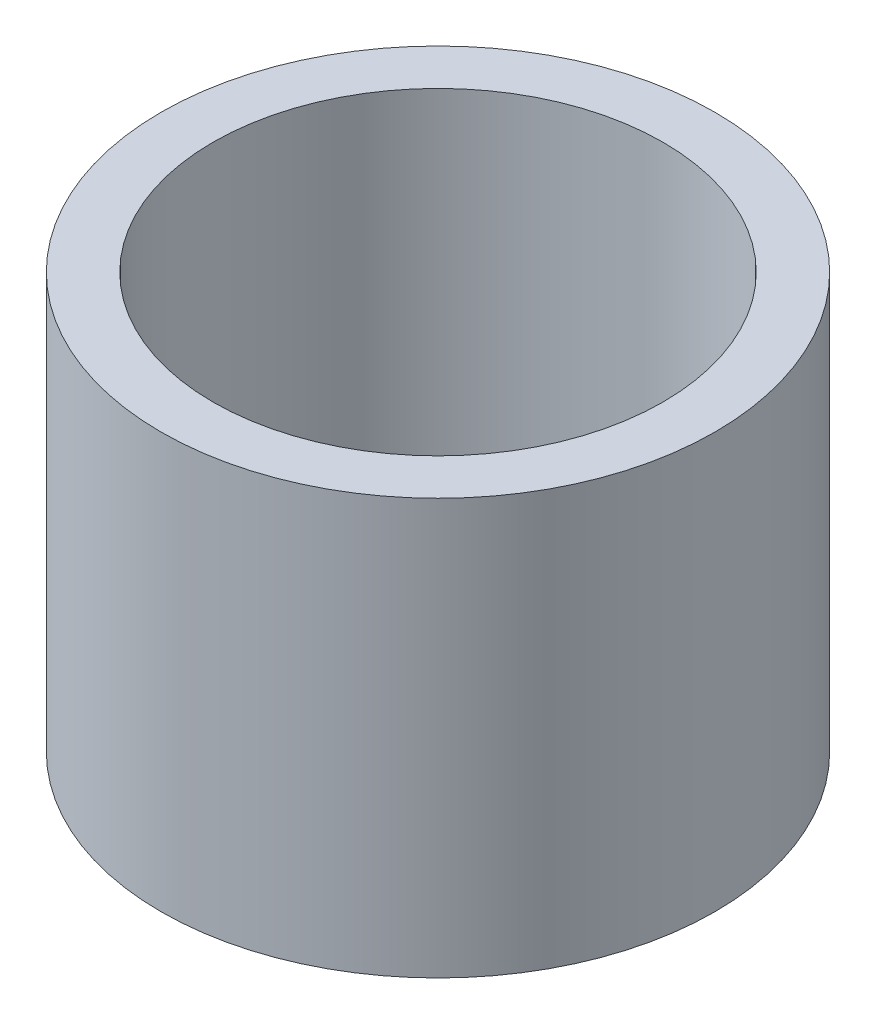
ISO-10303-21;
HEADER;
FILE_DESCRIPTION(('STEP AP214'),'2;1');
FILE_NAME('part.step','',(''),(''),'','','');
FILE_SCHEMA(('AUTOMOTIVE_DESIGN { 1 0 10303 214 1 1 1 1 }'));
ENDSEC;
DATA;
#1=APPLICATION_CONTEXT('core data for automotive mechanical design processes');
#2=APPLICATION_PROTOCOL_DEFINITION('international standard','automotive_design',2000,#1);
#3=PRODUCT_CONTEXT('',#1,'mechanical');
#4=PRODUCT('Part','Part','',(#3));
#5=PRODUCT_RELATED_PRODUCT_CATEGORY('part','',(#4));
#6=PRODUCT_DEFINITION_FORMATION('','',#4);
#7=PRODUCT_DEFINITION_CONTEXT('part definition',#1,'design');
#8=PRODUCT_DEFINITION('design','',#6,#7);
#9=PRODUCT_DEFINITION_SHAPE('','',#8);
#10=(LENGTH_UNIT() NAMED_UNIT(*) SI_UNIT(.MILLI.,.METRE.));
#11=(NAMED_UNIT(*) PLANE_ANGLE_UNIT() SI_UNIT($,.RADIAN.));
#12=(NAMED_UNIT(*) SI_UNIT($,.STERADIAN.) SOLID_ANGLE_UNIT());
#13=UNCERTAINTY_MEASURE_WITH_UNIT(LENGTH_MEASURE(1.E-05),#10,'distance_accuracy_value','');
#14=(GEOMETRIC_REPRESENTATION_CONTEXT(3) GLOBAL_UNCERTAINTY_ASSIGNED_CONTEXT((#13)) GLOBAL_UNIT_ASSIGNED_CONTEXT((#10,
#11,#12)) REPRESENTATION_CONTEXT('',''));
#15=CARTESIAN_POINT('',(0.,0.,0.));
#16=DIRECTION('',(0.,0.,1.));
#17=DIRECTION('',(1.,0.,0.));
#18=AXIS2_PLACEMENT_3D('',#15,#16,#17);
#19=CARTESIAN_POINT('',(0.,60.,0.));
#20=DIRECTION('',(0.,1.,0.));
#21=DIRECTION('',(0.,0.,1.));
#22=AXIS2_PLACEMENT_3D('',#19,#20,#21);
#23=PLANE('',#22);
#24=CARTESIAN_POINT('',(0.,60.,0.));
#25=DIRECTION('',(0.,1.,0.));
#26=DIRECTION('',(0.,0.,1.));
#27=AXIS2_PLACEMENT_3D('',#24,#25,#26);
#28=CIRCLE('',#27,40.);
#29=CARTESIAN_POINT('',(0.,60.,-40.));
#30=VERTEX_POINT('',#29);
#31=EDGE_CURVE('E10',#30,#30,#28,.T.);
#32=ORIENTED_EDGE('',*,*,#31,.T.);
#33=EDGE_LOOP('',(#32));
#34=FACE_BOUND('',#33,.T.);
#35=CARTESIAN_POINT('',(0.,60.,0.));
#36=DIRECTION('',(0.,1.,0.));
#37=DIRECTION('',(0.,0.,1.));
#38=AXIS2_PLACEMENT_3D('',#35,#36,#37);
#39=CIRCLE('',#38,32.5);
#40=CARTESIAN_POINT('',(0.,60.,-32.5));
#41=VERTEX_POINT('',#40);
#42=EDGE_CURVE('E50',#41,#41,#39,.T.);
#43=ORIENTED_EDGE('',*,*,#42,.F.);
#44=EDGE_LOOP('',(#43));
#45=FACE_BOUND('',#44,.T.);
#46=ADVANCED_FACE('F37',(#34,#45),#23,.T.);
#47=CARTESIAN_POINT('',(0.,0.,0.));
#48=DIRECTION('',(0.,1.,0.));
#49=DIRECTION('',(0.,0.,1.));
#50=AXIS2_PLACEMENT_3D('',#47,#48,#49);
#51=PLANE('',#50);
#52=CARTESIAN_POINT('',(0.,0.,0.));
#53=DIRECTION('',(0.,1.,0.));
#54=DIRECTION('',(0.,0.,1.));
#55=AXIS2_PLACEMENT_3D('',#52,#53,#54);
#56=CIRCLE('',#55,40.);
#57=CARTESIAN_POINT('',(0.,0.,-40.));
#58=VERTEX_POINT('',#57);
#59=EDGE_CURVE('E41',#58,#58,#56,.T.);
#60=ORIENTED_EDGE('',*,*,#59,.F.);
#61=EDGE_LOOP('',(#60));
#62=FACE_BOUND('',#61,.T.);
#63=CARTESIAN_POINT('',(0.,0.,0.));
#64=DIRECTION('',(0.,1.,0.));
#65=DIRECTION('',(0.,0.,1.));
#66=AXIS2_PLACEMENT_3D('',#63,#64,#65);
#67=CIRCLE('',#66,32.5);
#68=CARTESIAN_POINT('',(0.,0.,-32.5));
#69=VERTEX_POINT('',#68);
#70=EDGE_CURVE('E52',#69,#69,#67,.T.);
#71=ORIENTED_EDGE('',*,*,#70,.T.);
#72=EDGE_LOOP('',(#71));
#73=FACE_BOUND('',#72,.T.);
#74=ADVANCED_FACE('F64',(#62,#73),#51,.F.);
#75=CARTESIAN_POINT('',(0.,60.,0.));
#76=DIRECTION('',(0.,-1.,0.));
#77=DIRECTION('',(0.,0.,-1.));
#78=AXIS2_PLACEMENT_3D('',#75,#76,#77);
#79=CYLINDRICAL_SURFACE('',#78,40.);
#80=CARTESIAN_POINT('',(0.,60.,-40.));
#81=CARTESIAN_POINT('',(0.,59.375,-40.));
#82=CARTESIAN_POINT('',(0.,58.75,-40.));
#83=CARTESIAN_POINT('',(0.,57.5,-40.));
#84=CARTESIAN_POINT('',(0.,56.875,-40.));
#85=CARTESIAN_POINT('',(0.,55.625,-40.));
#86=CARTESIAN_POINT('',(0.,55.,-40.));
#87=CARTESIAN_POINT('',(0.,53.75,-40.));
#88=CARTESIAN_POINT('',(0.,53.125,-40.));
#89=CARTESIAN_POINT('',(0.,51.875,-40.));
#90=CARTESIAN_POINT('',(0.,51.25,-40.));
#91=CARTESIAN_POINT('',(0.,50.,-40.));
#92=CARTESIAN_POINT('',(0.,49.375,-40.));
#93=CARTESIAN_POINT('',(0.,48.125,-40.));
#94=CARTESIAN_POINT('',(0.,47.5,-40.));
#95=CARTESIAN_POINT('',(0.,46.25,-40.));
#96=CARTESIAN_POINT('',(0.,45.625,-40.));
#97=CARTESIAN_POINT('',(0.,44.375,-40.));
#98=CARTESIAN_POINT('',(0.,43.75,-40.));
#99=CARTESIAN_POINT('',(0.,42.5,-40.));
#100=CARTESIAN_POINT('',(0.,41.875,-40.));
#101=CARTESIAN_POINT('',(0.,40.625,-40.));
#102=CARTESIAN_POINT('',(0.,40.,-40.));
#103=CARTESIAN_POINT('',(0.,38.75,-40.));
#104=CARTESIAN_POINT('',(0.,38.125,-40.));
#105=CARTESIAN_POINT('',(0.,36.875,-40.));
#106=CARTESIAN_POINT('',(0.,36.25,-40.));
#107=CARTESIAN_POINT('',(0.,35.,-40.));
#108=CARTESIAN_POINT('',(0.,34.375,-40.));
#109=CARTESIAN_POINT('',(0.,33.125,-40.));
#110=CARTESIAN_POINT('',(0.,32.5,-40.));
#111=CARTESIAN_POINT('',(0.,31.25,-40.));
#112=CARTESIAN_POINT('',(0.,30.625,-40.));
#113=CARTESIAN_POINT('',(0.,29.375,-40.));
#114=CARTESIAN_POINT('',(0.,28.75,-40.));
#115=CARTESIAN_POINT('',(0.,27.5,-40.));
#116=CARTESIAN_POINT('',(0.,26.875,-40.));
#117=CARTESIAN_POINT('',(0.,25.625,-40.));
#118=CARTESIAN_POINT('',(0.,25.,-40.));
#119=CARTESIAN_POINT('',(0.,23.75,-40.));
#120=CARTESIAN_POINT('',(0.,23.125,-40.));
#121=CARTESIAN_POINT('',(0.,21.875,-40.));
#122=CARTESIAN_POINT('',(0.,21.25,-40.));
#123=CARTESIAN_POINT('',(0.,20.,-40.));
#124=CARTESIAN_POINT('',(0.,19.375,-40.));
#125=CARTESIAN_POINT('',(0.,18.125,-40.));
#126=CARTESIAN_POINT('',(0.,17.5,-40.));
#127=CARTESIAN_POINT('',(0.,16.25,-40.));
#128=CARTESIAN_POINT('',(0.,15.625,-40.));
#129=CARTESIAN_POINT('',(0.,14.375,-40.));
#130=CARTESIAN_POINT('',(0.,13.75,-40.));
#131=CARTESIAN_POINT('',(0.,12.5,-40.));
#132=CARTESIAN_POINT('',(0.,11.875,-40.));
#133=CARTESIAN_POINT('',(0.,10.625,-40.));
#134=CARTESIAN_POINT('',(0.,10.,-40.));
#135=CARTESIAN_POINT('',(0.,8.75,-40.));
#136=CARTESIAN_POINT('',(0.,8.125,-40.));
#137=CARTESIAN_POINT('',(0.,6.875,-40.));
#138=CARTESIAN_POINT('',(0.,6.25,-40.));
#139=CARTESIAN_POINT('',(0.,5.,-40.));
#140=CARTESIAN_POINT('',(0.,4.375,-40.));
#141=CARTESIAN_POINT('',(0.,3.125,-40.));
#142=CARTESIAN_POINT('',(0.,2.5,-40.));
#143=CARTESIAN_POINT('',(0.,1.25,-40.));
#144=CARTESIAN_POINT('',(0.,0.625000000000001,-40.));
#145=CARTESIAN_POINT('',(0.,0.,-40.));
#146=B_SPLINE_CURVE_WITH_KNOTS('',3,(#80,#81,#82,#83,#84,#85,#86,#87,#88,#89,#90,#91,#92,#93,
#94,#95,#96,#97,#98,#99,#100,#101,#102,#103,#104,#105,#106,#107,#108,#109,#110,#111,#112,#113,
#114,#115,#116,#117,#118,#119,#120,#121,#122,#123,#124,#125,#126,#127,#128,#129,#130,#131,#132,
#133,#134,#135,#136,#137,#138,#139,#140,#141,#142,#143,#144,#145),.UNSPECIFIED.,.F.,.F.,(4,2,2,
2,2,2,2,2,2,2,2,2,2,2,2,2,2,2,2,2,2,2,2,2,2,2,2,2,2,2,2,2,4),(0.,1.875,3.75,5.62500000000001,
7.50000000000001,9.375,11.25,13.125,15.,16.875,18.75,20.625,22.5,24.375,26.25,28.125,30.,31.875,
33.75,35.625,37.5,39.375,41.25,43.125,45.,46.875,48.75,50.625,52.5,54.375,56.25,58.125,60.),.UNSPECIFIED.);
#147=EDGE_CURVE('BSEAM39',#30,#58,#146,.T.);
#148=ORIENTED_EDGE('',*,*,#31,.F.);
#149=ORIENTED_EDGE('',*,*,#59,.T.);
#150=ORIENTED_EDGE('',*,*,#147,.T.);
#151=ORIENTED_EDGE('',*,*,#147,.F.);
#152=EDGE_LOOP('',(#148,#150,#149,#151));
#153=FACE_BOUND('',#152,.T.);
#154=ADVANCED_FACE('F39',(#153),#79,.T.);
#155=CARTESIAN_POINT('',(0.,60.,0.));
#156=DIRECTION('',(0.,-1.,0.));
#157=DIRECTION('',(0.,0.,-1.));
#158=AXIS2_PLACEMENT_3D('',#155,#156,#157);
#159=CYLINDRICAL_SURFACE('',#158,32.5);
#160=CARTESIAN_POINT('',(0.,60.,-32.5));
#161=CARTESIAN_POINT('',(0.,59.375,-32.5));
#162=CARTESIAN_POINT('',(0.,58.75,-32.5));
#163=CARTESIAN_POINT('',(0.,57.5,-32.5));
#164=CARTESIAN_POINT('',(0.,56.875,-32.5));
#165=CARTESIAN_POINT('',(0.,55.625,-32.5));
#166=CARTESIAN_POINT('',(0.,55.,-32.5));
#167=CARTESIAN_POINT('',(0.,53.75,-32.5));
#168=CARTESIAN_POINT('',(0.,53.125,-32.5));
#169=CARTESIAN_POINT('',(0.,51.875,-32.5));
#170=CARTESIAN_POINT('',(0.,51.25,-32.5));
#171=CARTESIAN_POINT('',(0.,50.,-32.5));
#172=CARTESIAN_POINT('',(0.,49.375,-32.5));
#173=CARTESIAN_POINT('',(0.,48.125,-32.5));
#174=CARTESIAN_POINT('',(0.,47.5,-32.5));
#175=CARTESIAN_POINT('',(0.,46.25,-32.5));
#176=CARTESIAN_POINT('',(0.,45.625,-32.5));
#177=CARTESIAN_POINT('',(0.,44.375,-32.5));
#178=CARTESIAN_POINT('',(0.,43.75,-32.5));
#179=CARTESIAN_POINT('',(0.,42.5,-32.5));
#180=CARTESIAN_POINT('',(0.,41.875,-32.5));
#181=CARTESIAN_POINT('',(0.,40.625,-32.5));
#182=CARTESIAN_POINT('',(0.,40.,-32.5));
#183=CARTESIAN_POINT('',(0.,38.75,-32.5));
#184=CARTESIAN_POINT('',(0.,38.125,-32.5));
#185=CARTESIAN_POINT('',(0.,36.875,-32.5));
#186=CARTESIAN_POINT('',(0.,36.25,-32.5));
#187=CARTESIAN_POINT('',(0.,35.,-32.5));
#188=CARTESIAN_POINT('',(0.,34.375,-32.5));
#189=CARTESIAN_POINT('',(0.,33.125,-32.5));
#190=CARTESIAN_POINT('',(0.,32.5,-32.5));
#191=CARTESIAN_POINT('',(0.,31.25,-32.5));
#192=CARTESIAN_POINT('',(0.,30.625,-32.5));
#193=CARTESIAN_POINT('',(0.,29.375,-32.5));
#194=CARTESIAN_POINT('',(0.,28.75,-32.5));
#195=CARTESIAN_POINT('',(0.,27.5,-32.5));
#196=CARTESIAN_POINT('',(0.,26.875,-32.5));
#197=CARTESIAN_POINT('',(0.,25.625,-32.5));
#198=CARTESIAN_POINT('',(0.,25.,-32.5));
#199=CARTESIAN_POINT('',(0.,23.75,-32.5));
#200=CARTESIAN_POINT('',(0.,23.125,-32.5));
#201=CARTESIAN_POINT('',(0.,21.875,-32.5));
#202=CARTESIAN_POINT('',(0.,21.25,-32.5));
#203=CARTESIAN_POINT('',(0.,20.,-32.5));
#204=CARTESIAN_POINT('',(0.,19.375,-32.5));
#205=CARTESIAN_POINT('',(0.,18.125,-32.5));
#206=CARTESIAN_POINT('',(0.,17.5,-32.5));
#207=CARTESIAN_POINT('',(0.,16.25,-32.5));
#208=CARTESIAN_POINT('',(0.,15.625,-32.5));
#209=CARTESIAN_POINT('',(0.,14.375,-32.5));
#210=CARTESIAN_POINT('',(0.,13.75,-32.5));
#211=CARTESIAN_POINT('',(0.,12.5,-32.5));
#212=CARTESIAN_POINT('',(0.,11.875,-32.5));
#213=CARTESIAN_POINT('',(0.,10.625,-32.5));
#214=CARTESIAN_POINT('',(0.,10.,-32.5));
#215=CARTESIAN_POINT('',(0.,8.75,-32.5));
#216=CARTESIAN_POINT('',(0.,8.125,-32.5));
#217=CARTESIAN_POINT('',(0.,6.875,-32.5));
#218=CARTESIAN_POINT('',(0.,6.25,-32.5));
#219=CARTESIAN_POINT('',(0.,5.,-32.5));
#220=CARTESIAN_POINT('',(0.,4.375,-32.5));
#221=CARTESIAN_POINT('',(0.,3.125,-32.5));
#222=CARTESIAN_POINT('',(0.,2.5,-32.5));
#223=CARTESIAN_POINT('',(0.,1.25,-32.5));
#224=CARTESIAN_POINT('',(0.,0.625000000000001,-32.5));
#225=CARTESIAN_POINT('',(0.,0.,-32.5));
#226=B_SPLINE_CURVE_WITH_KNOTS('',3,(#160,#161,#162,#163,#164,#165,#166,#167,#168,#169,#170,
#171,#172,#173,#174,#175,#176,#177,#178,#179,#180,#181,#182,#183,#184,#185,#186,#187,#188,#189,
#190,#191,#192,#193,#194,#195,#196,#197,#198,#199,#200,#201,#202,#203,#204,#205,#206,#207,#208,
#209,#210,#211,#212,#213,#214,#215,#216,#217,#218,#219,#220,#221,#222,#223,#224,#225),
.UNSPECIFIED.,.F.,.F.,(4,2,2,2,2,2,2,2,2,2,2,2,2,2,2,2,2,2,2,2,2,2,2,2,2,2,2,2,2,2,2,2,4),(0.,
1.87499999999999,3.75,5.625,7.49999999999999,9.37499999999999,11.25,13.125,15.,16.875,18.75,
20.625,22.5,24.375,26.25,28.125,30.,31.875,33.75,35.625,37.5,39.375,41.25,43.125,45.,46.875,
48.75,50.625,52.5,54.375,56.25,58.125,60.),.UNSPECIFIED.);
#227=EDGE_CURVE('BSEAM60',#41,#69,#226,.T.);
#228=ORIENTED_EDGE('',*,*,#42,.T.);
#229=ORIENTED_EDGE('',*,*,#70,.F.);
#230=ORIENTED_EDGE('',*,*,#227,.T.);
#231=ORIENTED_EDGE('',*,*,#227,.F.);
#232=EDGE_LOOP('',(#228,#230,#229,#231));
#233=FACE_BOUND('',#232,.T.);
#234=ADVANCED_FACE('F60',(#233),#159,.F.);
#235=CLOSED_SHELL('',(#46,#74,#154,#234));
#236=MANIFOLD_SOLID_BREP('B2',#235);
#237=ADVANCED_BREP_SHAPE_REPRESENTATION('',(#18,#236),#14);
#238=SHAPE_DEFINITION_REPRESENTATION(#9,#237);
ENDSEC;
END-ISO-10303-21;
